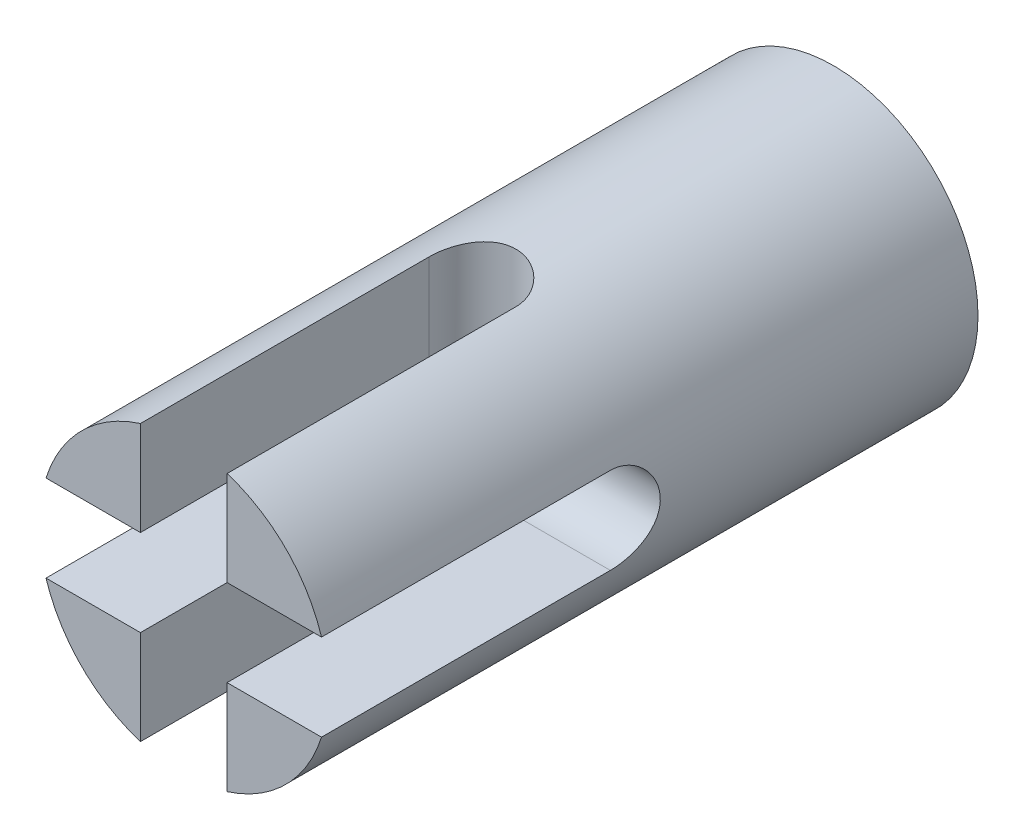
ISO-10303-21;
HEADER;
FILE_DESCRIPTION(('STEP AP214'),'2;1');
FILE_NAME('part.step','',(''),(''),'','','');
FILE_SCHEMA(('AUTOMOTIVE_DESIGN { 1 0 10303 214 1 1 1 1 }'));
ENDSEC;
DATA;
#1=APPLICATION_CONTEXT('core data for automotive mechanical design processes');
#2=APPLICATION_PROTOCOL_DEFINITION('international standard','automotive_design',2000,#1);
#3=PRODUCT_CONTEXT('',#1,'mechanical');
#4=PRODUCT('Part','Part','',(#3));
#5=PRODUCT_RELATED_PRODUCT_CATEGORY('part','',(#4));
#6=PRODUCT_DEFINITION_FORMATION('','',#4);
#7=PRODUCT_DEFINITION_CONTEXT('part definition',#1,'design');
#8=PRODUCT_DEFINITION('design','',#6,#7);
#9=PRODUCT_DEFINITION_SHAPE('','',#8);
#10=(LENGTH_UNIT() NAMED_UNIT(*) SI_UNIT(.MILLI.,.METRE.));
#11=(NAMED_UNIT(*) PLANE_ANGLE_UNIT() SI_UNIT($,.RADIAN.));
#12=(NAMED_UNIT(*) SI_UNIT($,.STERADIAN.) SOLID_ANGLE_UNIT());
#13=UNCERTAINTY_MEASURE_WITH_UNIT(LENGTH_MEASURE(1.E-05),#10,'distance_accuracy_value','');
#14=(GEOMETRIC_REPRESENTATION_CONTEXT(3) GLOBAL_UNCERTAINTY_ASSIGNED_CONTEXT((#13)) GLOBAL_UNIT_ASSIGNED_CONTEXT((#10,
#11,#12)) REPRESENTATION_CONTEXT('',''));
#15=CARTESIAN_POINT('',(0.,0.,0.));
#16=DIRECTION('',(0.,0.,1.));
#17=DIRECTION('',(1.,0.,0.));
#18=AXIS2_PLACEMENT_3D('',#15,#16,#17);
#19=CARTESIAN_POINT('',(0.,-22.5,25.));
#20=DIRECTION('',(0.,1.,0.));
#21=DIRECTION('',(0.,0.,1.));
#22=AXIS2_PLACEMENT_3D('',#19,#20,#21);
#23=CYLINDRICAL_SURFACE('',#22,3.);
#24=CARTESIAN_POINT('',(0.,0.,25.));
#25=DIRECTION('',(0.707106781186548,0.707106781186547,0.));
#26=DIRECTION('',(-0.707106781186548,0.707106781186547,0.));
#27=AXIS2_PLACEMENT_3D('',#24,#25,#26);
#28=ELLIPSE('',#27,4.24264068711929,3.);
#29=CARTESIAN_POINT('',(-3.,3.,25.));
#30=VERTEX_POINT('',#29);
#31=CARTESIAN_POINT('',(0.,0.,22.));
#32=VERTEX_POINT('',#31);
#33=EDGE_CURVE('E266',#30,#32,#28,.F.);
#34=ORIENTED_EDGE('',*,*,#33,.T.);
#35=CARTESIAN_POINT('',(0.,0.,25.));
#36=DIRECTION('',(-0.707106781186548,0.707106781186547,0.));
#37=DIRECTION('',(0.707106781186548,0.707106781186547,0.));
#38=AXIS2_PLACEMENT_3D('',#35,#36,#37);
#39=ELLIPSE('',#38,4.24264068711929,3.);
#40=CARTESIAN_POINT('',(3.,3.,25.));
#41=VERTEX_POINT('',#40);
#42=EDGE_CURVE('E162',#32,#41,#39,.F.);
#43=ORIENTED_EDGE('',*,*,#42,.T.);
#44=DIRECTION('',(0.,1.,0.));
#45=VECTOR('',#44,1.);
#46=CARTESIAN_POINT('',(3.,-22.5,25.));
#47=LINE('',#46,#45);
#48=CARTESIAN_POINT('',(3.,9.53939201416944,25.));
#49=VERTEX_POINT('',#48);
#50=EDGE_CURVE('E193',#41,#49,#47,.T.);
#51=ORIENTED_EDGE('',*,*,#50,.T.);
#52=CARTESIAN_POINT('',(-3.,9.53939201416946,25.));
#53=CARTESIAN_POINT('',(-3.00001027845727,9.53938054248207,24.9176644791773));
#54=CARTESIAN_POINT('',(-2.99661062684472,9.54045772064378,24.8353355449368));
#55=CARTESIAN_POINT('',(-2.98307142899347,9.54470412105986,24.6713060472345));
#56=CARTESIAN_POINT('',(-2.97293339805418,9.54787287296849,24.5896053466756));
#57=CARTESIAN_POINT('',(-2.94603140625045,9.55620668351003,24.4276150843268));
#58=CARTESIAN_POINT('',(-2.92928426957737,9.56136667250114,24.347322475957));
#59=CARTESIAN_POINT('',(-2.88932853030394,9.57351626651178,24.1885241558658));
#60=CARTESIAN_POINT('',(-2.8661197587264,9.58050591937828,24.1100184909326));
#61=CARTESIAN_POINT('',(-2.78708584446024,9.60391637654136,23.8780506120099));
#62=CARTESIAN_POINT('',(-2.72181852542972,9.62279007830391,23.727931561167));
#63=CARTESIAN_POINT('',(-2.56815043531276,9.66493213967819,23.440773956021));
#64=CARTESIAN_POINT('',(-2.4797388992416,9.68820254290641,23.3037415292378));
#65=CARTESIAN_POINT('',(-2.27929879634442,9.73733650515374,23.0422770120522));
#66=CARTESIAN_POINT('',(-2.16666914746584,9.76325505469874,22.9183151259391));
#67=CARTESIAN_POINT('',(-1.92227736150433,9.81429628475077,22.6907263851612));
#68=CARTESIAN_POINT('',(-1.79051199848164,9.8394188301941,22.587102966139));
#69=CARTESIAN_POINT('',(-1.50821997465697,9.88666477976534,22.4010731349054));
#70=CARTESIAN_POINT('',(-1.35736167401016,9.90871541546877,22.3191498202174));
#71=CARTESIAN_POINT('',(-1.04324233568303,9.94668940088144,22.1820229959971));
#72=CARTESIAN_POINT('',(-0.879984508687986,9.96261433032403,22.126812596632));
#73=CARTESIAN_POINT('',(-0.550649404820603,9.98615279768398,22.046240448209));
#74=CARTESIAN_POINT('',(-0.384786253016205,9.99399098526792,22.0200702964824));
#75=CARTESIAN_POINT('',(-0.0508471415689293,10.0012640407204,21.995765304854));
#76=CARTESIAN_POINT('',(0.117228393125338,10.0007004995012,21.9976251573218));
#77=CARTESIAN_POINT('',(0.445143199271824,9.99139205125586,22.0287858206914));
#78=CARTESIAN_POINT('',(0.605074290763028,9.98290831016512,22.0572106908081));
#79=CARTESIAN_POINT('',(0.917780104370315,9.95903027401822,22.1392632696255));
#80=CARTESIAN_POINT('',(1.07055445110879,9.94363561692558,22.1928922986827));
#81=CARTESIAN_POINT('',(1.36669563173912,9.90730429851782,22.3244244435247));
#82=CARTESIAN_POINT('',(1.50993201207613,9.88630511384915,22.4026032887761));
#83=CARTESIAN_POINT('',(1.78153105916101,9.84099249303646,22.5807971800344));
#84=CARTESIAN_POINT('',(1.90989038323251,9.81667831471806,22.6808171189407));
#85=CARTESIAN_POINT('',(2.15330901082206,9.7662334714278,22.9043839761846));
#86=CARTESIAN_POINT('',(2.26766702955976,9.74006890899097,23.0286877275262));
#87=CARTESIAN_POINT('',(2.47413538985067,9.68968430229327,23.2949948468511));
#88=CARTESIAN_POINT('',(2.56623924026181,9.66546482675134,23.4370033607298));
#89=CARTESIAN_POINT('',(2.72632814481702,9.62154457591303,23.7365618568999));
#90=CARTESIAN_POINT('',(2.79406012682263,9.60189192491895,23.8942543591871));
#91=CARTESIAN_POINT('',(2.90171772009405,9.56991327306402,24.2194490079631));
#92=CARTESIAN_POINT('',(2.94168586436073,9.55757606951749,24.3869357214287));
#93=CARTESIAN_POINT('',(2.97802407180159,9.54628064650012,24.6299897781404));
#94=CARTESIAN_POINT('',(2.98626405978018,9.54370312550533,24.7037814683592));
#95=CARTESIAN_POINT('',(2.99724711229709,9.54025857223564,24.851702958199));
#96=CARTESIAN_POINT('',(2.99999825936538,9.53938902493288,24.9258320993277));
#97=CARTESIAN_POINT('',(3.,9.53939201416945,25.));
#98=B_SPLINE_CURVE_WITH_KNOTS('',3,(#52,#53,#54,#55,#56,#57,#58,#59,#60,#61,#62,#63,#64,#65,#66,
#67,#68,#69,#70,#71,#72,#73,#74,#75,#76,#77,#78,#79,#80,#81,#82,#83,#84,#85,#86,#87,#88,#89,#90,
#91,#92,#93,#94,#95,#96,#97),.UNSPECIFIED.,.F.,.F.,(4,2,2,2,2,2,2,2,2,2,2,2,2,2,2,2,2,2,2,2,2,2,
4),(0.,0.246918142439467,0.493780777706087,0.740019009623012,0.986263681482023,1.47813347402025,
1.97023245590779,2.47635119822766,2.98255536239032,3.4992281062007,4.01576751791672,
4.51753600864763,5.019209488041,5.50490358251093,5.99062312360831,6.48200583350621,
6.9734987373917,7.48389234847122,7.99443465298715,8.51013494368214,9.02504345105574,
9.24774267716778,9.47011372732391),.UNSPECIFIED.);
#99=CARTESIAN_POINT('',(-3.,9.53939201416946,25.));
#100=VERTEX_POINT('',#99);
#101=EDGE_CURVE('E220',#100,#49,#98,.T.);
#102=ORIENTED_EDGE('',*,*,#101,.F.);
#103=DIRECTION('',(0.,1.,0.));
#104=VECTOR('',#103,1.);
#105=CARTESIAN_POINT('',(-3.,-22.5,25.));
#106=LINE('',#105,#104);
#107=EDGE_CURVE('E181',#30,#100,#106,.T.);
#108=ORIENTED_EDGE('',*,*,#107,.F.);
#109=EDGE_LOOP('',(#34,#43,#51,#102,#108));
#110=FACE_BOUND('',#109,.T.);
#111=ADVANCED_FACE('F41',(#110),#23,.F.);
#112=CARTESIAN_POINT('',(0.,0.,45.));
#113=DIRECTION('',(0.,0.,1.));
#114=DIRECTION('',(1.,0.,0.));
#115=AXIS2_PLACEMENT_3D('',#112,#113,#114);
#116=PLANE('',#115);
#117=DIRECTION('',(-1.,0.,0.));
#118=VECTOR('',#117,1.);
#119=CARTESIAN_POINT('',(14.5317517371379,3.,45.));
#120=LINE('',#119,#118);
#121=CARTESIAN_POINT('',(-2.99999999999999,3.,45.));
#122=VERTEX_POINT('',#121);
#123=CARTESIAN_POINT('',(-9.53939201416946,3.,45.));
#124=VERTEX_POINT('',#123);
#125=EDGE_CURVE('E297',#122,#124,#120,.T.);
#126=ORIENTED_EDGE('',*,*,#125,.F.);
#127=DIRECTION('',(0.,-1.,0.));
#128=VECTOR('',#127,1.);
#129=CARTESIAN_POINT('',(-2.99999999999999,0.,45.));
#130=LINE('',#129,#128);
#131=CARTESIAN_POINT('',(-2.99999999999999,9.53939201416944,45.));
#132=VERTEX_POINT('',#131);
#133=EDGE_CURVE('E217',#132,#122,#130,.T.);
#134=ORIENTED_EDGE('',*,*,#133,.F.);
#135=CARTESIAN_POINT('',(0.,0.,45.));
#136=DIRECTION('',(0.,0.,1.));
#137=DIRECTION('',(1.,0.,0.));
#138=AXIS2_PLACEMENT_3D('',#135,#136,#137);
#139=CIRCLE('',#138,10.);
#140=EDGE_CURVE('E208',#132,#124,#139,.T.);
#141=ORIENTED_EDGE('',*,*,#140,.T.);
#142=EDGE_LOOP('',(#126,#134,#141));
#143=FACE_BOUND('',#142,.T.);
#144=ADVANCED_FACE('F249',(#143),#116,.T.);
#145=CARTESIAN_POINT('',(9.53939201416946,3.,45.));
#146=VERTEX_POINT('',#145);
#147=CARTESIAN_POINT('',(3.00000000000001,3.,45.));
#148=VERTEX_POINT('',#147);
#149=EDGE_CURVE('E292',#146,#148,#120,.T.);
#150=ORIENTED_EDGE('',*,*,#149,.F.);
#151=CARTESIAN_POINT('',(3.00000000000001,9.53939201416944,45.));
#152=VERTEX_POINT('',#151);
#153=EDGE_CURVE('E207',#146,#152,#139,.T.);
#154=ORIENTED_EDGE('',*,*,#153,.T.);
#155=DIRECTION('',(0.,1.,0.));
#156=VECTOR('',#155,1.);
#157=CARTESIAN_POINT('',(3.00000000000001,0.,45.));
#158=LINE('',#157,#156);
#159=EDGE_CURVE('E216',#148,#152,#158,.T.);
#160=ORIENTED_EDGE('',*,*,#159,.F.);
#161=EDGE_LOOP('',(#150,#154,#160));
#162=FACE_BOUND('',#161,.T.);
#163=ADVANCED_FACE('F262',(#162),#116,.T.);
#164=CARTESIAN_POINT('',(-2.99999999999999,-22.5,45.));
#165=DIRECTION('',(-1.,0.,0.));
#166=DIRECTION('',(0.,0.,1.));
#167=AXIS2_PLACEMENT_3D('',#164,#165,#166);
#168=PLANE('',#167);
#169=ORIENTED_EDGE('',*,*,#133,.T.);
#170=DIRECTION('',(0.,0.,-1.));
#171=VECTOR('',#170,1.);
#172=CARTESIAN_POINT('',(-2.99999999999999,3.,45.));
#173=LINE('',#172,#171);
#174=EDGE_CURVE('E306',#122,#30,#173,.T.);
#175=ORIENTED_EDGE('',*,*,#174,.T.);
#176=ORIENTED_EDGE('',*,*,#107,.T.);
#177=DIRECTION('',(0.,0.,-1.));
#178=VECTOR('',#177,1.);
#179=CARTESIAN_POINT('',(-2.99999999999999,9.53939201416946,45.));
#180=LINE('',#179,#178);
#181=EDGE_CURVE('E66',#132,#100,#180,.T.);
#182=ORIENTED_EDGE('',*,*,#181,.F.);
#183=EDGE_LOOP('',(#169,#175,#176,#182));
#184=FACE_BOUND('',#183,.T.);
#185=ADVANCED_FACE('F379',(#184),#168,.F.);
#186=CARTESIAN_POINT('',(3.00000000000001,-22.5,45.));
#187=DIRECTION('',(1.,0.,0.));
#188=DIRECTION('',(0.,0.,-1.));
#189=AXIS2_PLACEMENT_3D('',#186,#187,#188);
#190=PLANE('',#189);
#191=ORIENTED_EDGE('',*,*,#50,.F.);
#192=DIRECTION('',(0.,0.,1.));
#193=VECTOR('',#192,1.);
#194=CARTESIAN_POINT('',(3.00000000000001,3.,45.));
#195=LINE('',#194,#193);
#196=EDGE_CURVE('E11',#41,#148,#195,.T.);
#197=ORIENTED_EDGE('',*,*,#196,.T.);
#198=ORIENTED_EDGE('',*,*,#159,.T.);
#199=DIRECTION('',(0.,0.,-1.));
#200=VECTOR('',#199,1.);
#201=CARTESIAN_POINT('',(3.,9.53939201416945,45.));
#202=LINE('',#201,#200);
#203=EDGE_CURVE('E180',#49,#152,#202,.F.);
#204=ORIENTED_EDGE('',*,*,#203,.F.);
#205=EDGE_LOOP('',(#191,#197,#198,#204));
#206=FACE_BOUND('',#205,.T.);
#207=ADVANCED_FACE('F245',(#206),#190,.F.);
#208=DIRECTION('',(1.,0.,0.));
#209=VECTOR('',#208,1.);
#210=CARTESIAN_POINT('',(14.5317517371379,-3.,45.));
#211=LINE('',#210,#209);
#212=CARTESIAN_POINT('',(-9.53939201416946,-3.,45.));
#213=VERTEX_POINT('',#212);
#214=CARTESIAN_POINT('',(-2.99999999999999,-3.,45.));
#215=VERTEX_POINT('',#214);
#216=EDGE_CURVE('E168',#213,#215,#211,.T.);
#217=ORIENTED_EDGE('',*,*,#216,.F.);
#218=CARTESIAN_POINT('',(-2.99999999999999,-9.53939201416946,45.));
#219=VERTEX_POINT('',#218);
#220=EDGE_CURVE('E206',#213,#219,#139,.T.);
#221=ORIENTED_EDGE('',*,*,#220,.T.);
#222=EDGE_CURVE('E215',#215,#219,#130,.T.);
#223=ORIENTED_EDGE('',*,*,#222,.F.);
#224=EDGE_LOOP('',(#217,#221,#223));
#225=FACE_BOUND('',#224,.T.);
#226=ADVANCED_FACE('F250',(#225),#116,.T.);
#227=CARTESIAN_POINT('',(0.,0.,45.));
#228=DIRECTION('',(0.,0.,-1.));
#229=DIRECTION('',(-1.,0.,0.));
#230=AXIS2_PLACEMENT_3D('',#227,#228,#229);
#231=CYLINDRICAL_SURFACE('',#230,10.);
#232=DIRECTION('',(0.,0.,-1.));
#233=VECTOR('',#232,1.);
#234=CARTESIAN_POINT('',(-9.53939201416945,-3.,45.));
#235=LINE('',#234,#233);
#236=CARTESIAN_POINT('',(-9.53939201416946,-3.,25.));
#237=VERTEX_POINT('',#236);
#238=EDGE_CURVE('E303',#213,#237,#235,.T.);
#239=ORIENTED_EDGE('',*,*,#238,.T.);
#240=CARTESIAN_POINT('',(-10.,0.,28.));
#241=CARTESIAN_POINT('',(-9.99999858501101,-0.1645772255066,27.9999980050302));
#242=CARTESIAN_POINT('',(-9.99589831387907,-0.329174636703059,27.9864122727521));
#243=CARTESIAN_POINT('',(-9.97994211187382,-0.653576250609761,27.9325572915558));
#244=CARTESIAN_POINT('',(-9.96808386779384,-0.81337900882284,27.8922800839533));
#245=CARTESIAN_POINT('',(-9.93791105003673,-1.12346541550905,27.7865079661795));
#246=CARTESIAN_POINT('',(-9.91960600500851,-1.27376272879075,27.7210502607621));
#247=CARTESIAN_POINT('',(-9.87844218475291,-1.56124836210626,27.5669278138883));
#248=CARTESIAN_POINT('',(-9.85558280384133,-1.69843493493934,27.4782599852092));
#249=CARTESIAN_POINT('',(-9.80701474385548,-1.95974359436749,27.2775519850547));
#250=CARTESIAN_POINT('',(-9.78124767314073,-2.08343614248868,27.1649667482282));
#251=CARTESIAN_POINT('',(-9.73011668420884,-2.31049841846648,26.9207815401796));
#252=CARTESIAN_POINT('',(-9.70475283449003,-2.41386472654882,26.7891783757501));
#253=CARTESIAN_POINT('',(-9.65668227987544,-2.59960075447415,26.5070584939248));
#254=CARTESIAN_POINT('',(-9.63404813327749,-2.68144618044427,26.3561830780185));
#255=CARTESIAN_POINT('',(-9.59487240788062,-2.81842789549521,26.0420214915394));
#256=CARTESIAN_POINT('',(-9.57832936626621,-2.87357059839947,25.8787383121441));
#257=CARTESIAN_POINT('',(-9.55381741676868,-2.95403267365303,25.5492194677391));
#258=CARTESIAN_POINT('',(-9.54562138649067,-2.98014392469355,25.3831945122721));
#259=CARTESIAN_POINT('',(-9.53805579499534,-3.00427461229344,25.0489336875665));
#260=CARTESIAN_POINT('',(-9.53868409521142,-3.00230085522157,24.8806983638818));
#261=CARTESIAN_POINT('',(-9.54849488135555,-2.97093954399624,24.553232182783));
#262=CARTESIAN_POINT('',(-9.55736777198281,-2.94254410525371,24.3938954992755));
#263=CARTESIAN_POINT('',(-9.58216712457248,-2.86074840854112,24.0823604274531));
#264=CARTESIAN_POINT('',(-9.59809428264701,-2.80734568283282,23.9301627452513));
#265=CARTESIAN_POINT('',(-9.63545466149946,-2.67632053307364,23.6347993006785));
#266=CARTESIAN_POINT('',(-9.65696032231904,-2.59837633869285,23.4917858320895));
#267=CARTESIAN_POINT('',(-9.70301974000129,-2.42070445177367,23.2205359559796));
#268=CARTESIAN_POINT('',(-9.72757423493982,-2.32097148005177,23.0923031411724));
#269=CARTESIAN_POINT('',(-9.77822022595875,-2.09762581531093,22.848627618476));
#270=CARTESIAN_POINT('',(-9.80433308620996,-1.97318981493395,22.7339426719407));
#271=CARTESIAN_POINT('',(-9.85424488126517,-1.70652651862794,22.5268920318715));
#272=CARTESIAN_POINT('',(-9.8780436703682,-1.56429810372178,22.4345277431711));
#273=CARTESIAN_POINT('',(-9.92086320138941,-1.26471007668561,22.2742801550705));
#274=CARTESIAN_POINT('',(-9.93985087336628,-1.1072554994959,22.2065649675003));
#275=CARTESIAN_POINT('',(-9.97067043664444,-0.782490831207043,22.0988008198007));
#276=CARTESIAN_POINT('',(-9.98250432373999,-0.615183503179168,22.058744142935));
#277=CARTESIAN_POINT('',(-9.99736729287077,-0.281904485336667,22.0086956442012));
#278=CARTESIAN_POINT('',(-10.0006970083558,-0.116100195202377,21.9976768283968));
#279=CARTESIAN_POINT('',(-9.99905846483519,0.214999211646763,22.0031383114242));
#280=CARTESIAN_POINT('',(-9.99409131355514,0.380294393381558,22.0196149393029));
#281=CARTESIAN_POINT('',(-9.97661393974325,0.701807210619391,22.078769222223));
#282=CARTESIAN_POINT('',(-9.96427659598829,0.858145545228336,22.1208467751617));
#283=CARTESIAN_POINT('',(-9.9334869568307,1.16150927790904,22.2292864655564));
#284=CARTESIAN_POINT('',(-9.91503392642188,1.30853355405117,22.2956515220757));
#285=CARTESIAN_POINT('',(-9.87339308702631,1.5928743789221,22.4525063309623));
#286=CARTESIAN_POINT('',(-9.8501056165928,1.72988765239933,22.543518681896));
#287=CARTESIAN_POINT('',(-9.80146937528705,1.9870466159603,22.7464495081056));
#288=CARTESIAN_POINT('',(-9.7761200886242,2.10718806471188,22.8583732237753));
#289=CARTESIAN_POINT('',(-9.72506343738007,2.33171489102052,23.1047746167387));
#290=CARTESIAN_POINT('',(-9.69937650065513,2.43536962463001,23.2399237515436));
#291=CARTESIAN_POINT('',(-9.65153030477949,2.61857990144313,23.5262558780269));
#292=CARTESIAN_POINT('',(-9.62937095313121,2.69813607658965,23.6774384491158));
#293=CARTESIAN_POINT('',(-9.5913437922631,2.83034694254316,23.99106498251));
#294=CARTESIAN_POINT('',(-9.57544675673501,2.88312693874021,24.1534523730757));
#295=CARTESIAN_POINT('',(-9.55183188739737,2.96043461630306,24.4853759378605));
#296=CARTESIAN_POINT('',(-9.54411125069387,2.98497197957849,24.6549096415661));
#297=CARTESIAN_POINT('',(-9.53799944941558,3.0044396896993,24.9887230367768));
#298=CARTESIAN_POINT('',(-9.53923294700394,3.00056110615887,25.1529273020988));
#299=CARTESIAN_POINT('',(-9.54998802392188,2.9661501088861,25.4782282068012));
#300=CARTESIAN_POINT('',(-9.55950927135902,2.93561876249408,25.639324970361));
#301=CARTESIAN_POINT('',(-9.58551527389243,2.84953777608686,25.9518907982633));
#302=CARTESIAN_POINT('',(-9.60191209104934,2.79430351014248,26.1034545747174));
#303=CARTESIAN_POINT('',(-9.63980557805265,2.66063014242147,26.3952848776414));
#304=CARTESIAN_POINT('',(-9.6613032238508,2.58218659925722,26.5355492352831));
#305=CARTESIAN_POINT('',(-9.70795352855338,2.40097527610176,26.8063262330525));
#306=CARTESIAN_POINT('',(-9.7332108032858,2.29742552185996,26.9362975225204));
#307=CARTESIAN_POINT('',(-9.78402640899066,2.07034869259555,27.1774049966162));
#308=CARTESIAN_POINT('',(-9.80958481647543,1.94681643426898,27.2885362789356));
#309=CARTESIAN_POINT('',(-9.85901873141573,1.67893152436652,27.4920468245899));
#310=CARTESIAN_POINT('',(-9.88282319531421,1.53407577158122,27.5837828937109));
#311=CARTESIAN_POINT('',(-9.92521360911553,1.23028274796705,27.7414703398081));
#312=CARTESIAN_POINT('',(-9.94380199862114,1.07135210599791,27.807433776549));
#313=CARTESIAN_POINT('',(-9.97204349938619,0.761515425310564,27.9057905513055));
#314=CARTESIAN_POINT('',(-9.9824405476214,0.611573923908468,27.9410233457665));
#315=CARTESIAN_POINT('',(-9.9964188898898,0.307760390461558,27.9881270504832));
#316=CARTESIAN_POINT('',(-10.0000013230948,0.153889019716279,28.0000018654096));
#317=CARTESIAN_POINT('',(-10.,0.,28.));
#318=B_SPLINE_CURVE_WITH_KNOTS('',3,(#240,#241,#242,#243,#244,#245,#246,#247,#248,#249,#250,
#251,#252,#253,#254,#255,#256,#257,#258,#259,#260,#261,#262,#263,#264,#265,#266,#267,#268,#269,
#270,#271,#272,#273,#274,#275,#276,#277,#278,#279,#280,#281,#282,#283,#284,#285,#286,#287,#288,
#289,#290,#291,#292,#293,#294,#295,#296,#297,#298,#299,#300,#301,#302,#303,#304,#305,#306,#307,
#308,#309,#310,#311,#312,#313,#314,#315,#316,#317),.UNSPECIFIED.,.T.,.F.,(4,2,2,2,2,2,2,2,2,2,2,
2,2,2,2,2,2,2,2,2,2,2,2,2,2,2,2,2,2,2,2,2,2,2,2,2,2,2,4),(0.,0.493166407225221,0.986479929692,
1.47906735260175,1.97172032882541,2.47711205896383,2.98258874577266,3.49942962008218,
4.01614629086447,4.51839378713198,5.02051956638179,5.50452033395352,5.98856887316002,
6.47924852894239,6.97004720317111,7.48134208096333,7.99266913062143,8.50742093763377,
9.02202907057615,9.5181761887709,10.0142570710065,10.4991349336465,10.9840710918746,
11.4802261140582,11.9765056400038,12.4908080064564,13.0050968850536,13.516956299025,
14.0286401892057,14.5190031093854,15.0093463933232,15.4936008081456,15.9779479511534,
16.4799385136898,16.9820594980413,17.4988599232246,18.0154182319959,18.4766338387004,
18.9377723390687),.UNSPECIFIED.);
#319=CARTESIAN_POINT('',(-9.53939201416944,3.00000000000007,25.0000000000001));
#320=VERTEX_POINT('',#319);
#321=EDGE_CURVE('E144',#237,#320,#318,.T.);
#322=ORIENTED_EDGE('',*,*,#321,.T.);
#323=DIRECTION('',(0.,0.,-1.));
#324=VECTOR('',#323,1.);
#325=CARTESIAN_POINT('',(-9.53939201416945,3.,45.));
#326=LINE('',#325,#324);
#327=EDGE_CURVE('E309',#320,#124,#326,.F.);
#328=ORIENTED_EDGE('',*,*,#327,.T.);
#329=ORIENTED_EDGE('',*,*,#140,.F.);
#330=ORIENTED_EDGE('',*,*,#181,.T.);
#331=ORIENTED_EDGE('',*,*,#101,.T.);
#332=ORIENTED_EDGE('',*,*,#203,.T.);
#333=ORIENTED_EDGE('',*,*,#153,.F.);
#334=DIRECTION('',(0.,0.,-1.));
#335=VECTOR('',#334,1.);
#336=CARTESIAN_POINT('',(9.53939201416945,3.,45.));
#337=LINE('',#336,#335);
#338=CARTESIAN_POINT('',(9.53939201416946,3.,25.));
#339=VERTEX_POINT('',#338);
#340=EDGE_CURVE('E190',#146,#339,#337,.T.);
#341=ORIENTED_EDGE('',*,*,#340,.T.);
#342=CARTESIAN_POINT('',(10.,0.,28.));
#343=CARTESIAN_POINT('',(9.999998585011,0.164577225506598,27.9999980050302));
#344=CARTESIAN_POINT('',(9.99589831387907,0.329174636703057,27.9864122727521));
#345=CARTESIAN_POINT('',(9.97994211187382,0.65357625060976,27.9325572915558));
#346=CARTESIAN_POINT('',(9.96808386779384,0.813379008822838,27.8922800839533));
#347=CARTESIAN_POINT('',(9.93791105003673,1.12346541550905,27.7865079661795));
#348=CARTESIAN_POINT('',(9.91960600500851,1.27376272879075,27.7210502607621));
#349=CARTESIAN_POINT('',(9.87844218475291,1.56124836210626,27.5669278138883));
#350=CARTESIAN_POINT('',(9.85558280384133,1.69843493493934,27.4782599852092));
#351=CARTESIAN_POINT('',(9.80701474385548,1.95974359436749,27.2775519850547));
#352=CARTESIAN_POINT('',(9.78124767314073,2.08343614248868,27.1649667482282));
#353=CARTESIAN_POINT('',(9.73011668420884,2.31049841846647,26.9207815401796));
#354=CARTESIAN_POINT('',(9.70475283449003,2.41386472654882,26.7891783757501));
#355=CARTESIAN_POINT('',(9.65668227987544,2.59960075447415,26.5070584939248));
#356=CARTESIAN_POINT('',(9.63404813327749,2.68144618044427,26.3561830780185));
#357=CARTESIAN_POINT('',(9.59487240788062,2.81842789549521,26.0420214915394));
#358=CARTESIAN_POINT('',(9.57832936626621,2.87357059839947,25.878738312144));
#359=CARTESIAN_POINT('',(9.55381741676868,2.95403267365303,25.5492194677391));
#360=CARTESIAN_POINT('',(9.54562138649067,2.98014392469355,25.3831945122721));
#361=CARTESIAN_POINT('',(9.53805579499534,3.00427461229344,25.0489336875665));
#362=CARTESIAN_POINT('',(9.53868409521142,3.00230085522157,24.8806983638818));
#363=CARTESIAN_POINT('',(9.54849488135555,2.97093954399623,24.553232182783));
#364=CARTESIAN_POINT('',(9.55736777198281,2.9425441052537,24.3938954992755));
#365=CARTESIAN_POINT('',(9.58216712457249,2.86074840854112,24.0823604274531));
#366=CARTESIAN_POINT('',(9.59809428264701,2.80734568283282,23.9301627452513));
#367=CARTESIAN_POINT('',(9.63545466149946,2.67632053307363,23.6347993006785));
#368=CARTESIAN_POINT('',(9.65696032231904,2.59837633869285,23.4917858320895));
#369=CARTESIAN_POINT('',(9.70301974000129,2.42070445177367,23.2205359559796));
#370=CARTESIAN_POINT('',(9.72757423493982,2.32097148005177,23.0923031411724));
#371=CARTESIAN_POINT('',(9.77822022595875,2.09762581531093,22.848627618476));
#372=CARTESIAN_POINT('',(9.80433308620996,1.97318981493394,22.7339426719407));
#373=CARTESIAN_POINT('',(9.85424488126517,1.70652651862793,22.5268920318715));
#374=CARTESIAN_POINT('',(9.8780436703682,1.56429810372177,22.4345277431711));
#375=CARTESIAN_POINT('',(9.92086320138941,1.2647100766856,22.2742801550705));
#376=CARTESIAN_POINT('',(9.93985087336628,1.1072554994959,22.2065649675003));
#377=CARTESIAN_POINT('',(9.97067043664444,0.782490831207037,22.0988008198007));
#378=CARTESIAN_POINT('',(9.98250432373999,0.615183503179161,22.058744142935));
#379=CARTESIAN_POINT('',(9.99736729287077,0.281904485336662,22.0086956442012));
#380=CARTESIAN_POINT('',(10.0006970083558,0.116100195202372,21.9976768283968));
#381=CARTESIAN_POINT('',(9.99905846483519,-0.214999211646768,22.0031383114242));
#382=CARTESIAN_POINT('',(9.99409131355514,-0.380294393381564,22.0196149393029));
#383=CARTESIAN_POINT('',(9.97661393974325,-0.701807210619397,22.078769222223));
#384=CARTESIAN_POINT('',(9.96427659598829,-0.858145545228341,22.1208467751617));
#385=CARTESIAN_POINT('',(9.9334869568307,-1.16150927790905,22.2292864655564));
#386=CARTESIAN_POINT('',(9.91503392642188,-1.30853355405117,22.2956515220757));
#387=CARTESIAN_POINT('',(9.87339308702631,-1.59287437892211,22.4525063309623));
#388=CARTESIAN_POINT('',(9.8501056165928,-1.72988765239934,22.543518681896));
#389=CARTESIAN_POINT('',(9.80146937528704,-1.9870466159603,22.7464495081056));
#390=CARTESIAN_POINT('',(9.7761200886242,-2.10718806471189,22.8583732237753));
#391=CARTESIAN_POINT('',(9.72506343738007,-2.33171489102053,23.1047746167387));
#392=CARTESIAN_POINT('',(9.69937650065513,-2.43536962463002,23.2399237515436));
#393=CARTESIAN_POINT('',(9.65153030477949,-2.61857990144313,23.5262558780269));
#394=CARTESIAN_POINT('',(9.62937095313121,-2.69813607658965,23.6774384491158));
#395=CARTESIAN_POINT('',(9.59134379226309,-2.83034694254316,23.99106498251));
#396=CARTESIAN_POINT('',(9.575446756735,-2.88312693874022,24.1534523730757));
#397=CARTESIAN_POINT('',(9.55183188739737,-2.96043461630306,24.4853759378605));
#398=CARTESIAN_POINT('',(9.54411125069387,-2.98497197957849,24.6549096415661));
#399=CARTESIAN_POINT('',(9.53799944941558,-3.0044396896993,24.9887230367768));
#400=CARTESIAN_POINT('',(9.53923294700394,-3.00056110615887,25.1529273020988));
#401=CARTESIAN_POINT('',(9.54998802392188,-2.96615010888611,25.4782282068012));
#402=CARTESIAN_POINT('',(9.55950927135902,-2.93561876249408,25.639324970361));
#403=CARTESIAN_POINT('',(9.58551527389243,-2.84953777608686,25.9518907982633));
#404=CARTESIAN_POINT('',(9.60191209104934,-2.79430351014248,26.1034545747174));
#405=CARTESIAN_POINT('',(9.63980557805265,-2.66063014242148,26.3952848776414));
#406=CARTESIAN_POINT('',(9.6613032238508,-2.58218659925723,26.5355492352831));
#407=CARTESIAN_POINT('',(9.70795352855338,-2.40097527610176,26.8063262330525));
#408=CARTESIAN_POINT('',(9.7332108032858,-2.29742552185996,26.9362975225204));
#409=CARTESIAN_POINT('',(9.78402640899066,-2.07034869259556,27.1774049966162));
#410=CARTESIAN_POINT('',(9.80958481647543,-1.94681643426898,27.2885362789356));
#411=CARTESIAN_POINT('',(9.85901873141573,-1.67893152436652,27.4920468245899));
#412=CARTESIAN_POINT('',(9.88282319531422,-1.53407577158122,27.5837828937109));
#413=CARTESIAN_POINT('',(9.92521360911553,-1.23028274796705,27.7414703398081));
#414=CARTESIAN_POINT('',(9.94380199862114,-1.07135210599791,27.807433776549));
#415=CARTESIAN_POINT('',(9.97204349938619,-0.761515425310564,27.9057905513055));
#416=CARTESIAN_POINT('',(9.9824405476214,-0.611573923908469,27.9410233457665));
#417=CARTESIAN_POINT('',(9.9964188898898,-0.307760390461559,27.9881270504832));
#418=CARTESIAN_POINT('',(10.0000013230948,-0.15388901971628,28.0000018654096));
#419=CARTESIAN_POINT('',(10.,0.,28.));
#420=B_SPLINE_CURVE_WITH_KNOTS('',3,(#342,#343,#344,#345,#346,#347,#348,#349,#350,#351,#352,
#353,#354,#355,#356,#357,#358,#359,#360,#361,#362,#363,#364,#365,#366,#367,#368,#369,#370,#371,
#372,#373,#374,#375,#376,#377,#378,#379,#380,#381,#382,#383,#384,#385,#386,#387,#388,#389,#390,
#391,#392,#393,#394,#395,#396,#397,#398,#399,#400,#401,#402,#403,#404,#405,#406,#407,#408,#409,
#410,#411,#412,#413,#414,#415,#416,#417,#418,#419),.UNSPECIFIED.,.T.,.F.,(4,2,2,2,2,2,2,2,2,2,2,
2,2,2,2,2,2,2,2,2,2,2,2,2,2,2,2,2,2,2,2,2,2,2,2,2,2,2,4),(0.,0.493166407225221,0.986479929692,
1.47906735260175,1.97172032882541,2.47711205896383,2.98258874577266,3.49942962008218,
4.01614629086448,4.51839378713198,5.02051956638179,5.50452033395352,5.98856887316003,
6.47924852894239,6.97004720317111,7.48134208096334,7.99266913062143,8.50742093763377,
9.02202907057616,9.5181761887709,10.0142570710065,10.4991349336465,10.9840710918746,
11.4802261140582,11.9765056400038,12.4908080064564,13.0050968850536,13.516956299025,
14.0286401892057,14.5190031093854,15.0093463933232,15.4936008081456,15.9779479511534,
16.4799385136898,16.9820594980413,17.4988599232246,18.0154182319959,18.4766338387004,
18.9377723390687),.UNSPECIFIED.);
#421=CARTESIAN_POINT('',(9.53939201416946,-3.,25.));
#422=VERTEX_POINT('',#421);
#423=EDGE_CURVE('E272',#339,#422,#420,.T.);
#424=ORIENTED_EDGE('',*,*,#423,.T.);
#425=DIRECTION('',(0.,0.,-1.));
#426=VECTOR('',#425,1.);
#427=CARTESIAN_POINT('',(9.53939201416945,-3.,45.));
#428=LINE('',#427,#426);
#429=CARTESIAN_POINT('',(9.53939201416946,-3.,45.));
#430=VERTEX_POINT('',#429);
#431=EDGE_CURVE('E173',#422,#430,#428,.F.);
#432=ORIENTED_EDGE('',*,*,#431,.T.);
#433=CARTESIAN_POINT('',(3.00000000000001,-9.53939201416945,45.));
#434=VERTEX_POINT('',#433);
#435=EDGE_CURVE('E202',#434,#430,#139,.T.);
#436=ORIENTED_EDGE('',*,*,#435,.F.);
#437=DIRECTION('',(0.,0.,-1.));
#438=VECTOR('',#437,1.);
#439=CARTESIAN_POINT('',(3.,-9.53939201416945,45.));
#440=LINE('',#439,#438);
#441=CARTESIAN_POINT('',(3.,-9.53939201416946,25.));
#442=VERTEX_POINT('',#441);
#443=EDGE_CURVE('E58',#434,#442,#440,.T.);
#444=ORIENTED_EDGE('',*,*,#443,.T.);
#445=CARTESIAN_POINT('',(3.,-9.53939201416945,25.));
#446=CARTESIAN_POINT('',(3.00001027845728,-9.53938054248206,24.9176644791773));
#447=CARTESIAN_POINT('',(2.99661062684473,-9.54045772064378,24.8353355449368));
#448=CARTESIAN_POINT('',(2.98307142899347,-9.54470412105986,24.6713060472345));
#449=CARTESIAN_POINT('',(2.97293339805419,-9.54787287296848,24.5896053466756));
#450=CARTESIAN_POINT('',(2.94603140625045,-9.55620668351003,24.4276150843268));
#451=CARTESIAN_POINT('',(2.92928426957737,-9.56136667250114,24.347322475957));
#452=CARTESIAN_POINT('',(2.88932853030395,-9.57351626651178,24.1885241558658));
#453=CARTESIAN_POINT('',(2.86611975872641,-9.58050591937828,24.1100184909326));
#454=CARTESIAN_POINT('',(2.78708584446025,-9.60391637654137,23.8780506120099));
#455=CARTESIAN_POINT('',(2.72181852542973,-9.62279007830391,23.727931561167));
#456=CARTESIAN_POINT('',(2.56815043531276,-9.66493213967819,23.440773956021));
#457=CARTESIAN_POINT('',(2.4797388992416,-9.68820254290641,23.3037415292378));
#458=CARTESIAN_POINT('',(2.27929879634443,-9.73733650515374,23.0422770120522));
#459=CARTESIAN_POINT('',(2.16666914746584,-9.76325505469874,22.9183151259391));
#460=CARTESIAN_POINT('',(1.92227736150433,-9.81429628475077,22.6907263851612));
#461=CARTESIAN_POINT('',(1.79051199848164,-9.8394188301941,22.587102966139));
#462=CARTESIAN_POINT('',(1.50821997465697,-9.88666477976534,22.4010731349054));
#463=CARTESIAN_POINT('',(1.35736167401016,-9.90871541546877,22.3191498202174));
#464=CARTESIAN_POINT('',(1.04324233568303,-9.94668940088144,22.1820229959971));
#465=CARTESIAN_POINT('',(0.879984508687987,-9.96261433032403,22.126812596632));
#466=CARTESIAN_POINT('',(0.550649404820604,-9.98615279768398,22.046240448209));
#467=CARTESIAN_POINT('',(0.384786253016205,-9.99399098526792,22.0200702964824));
#468=CARTESIAN_POINT('',(0.0508471415689298,-10.0012640407204,21.995765304854));
#469=CARTESIAN_POINT('',(-0.117228393125337,-10.0007004995012,21.9976251573218));
#470=CARTESIAN_POINT('',(-0.445143199271822,-9.99139205125586,22.0287858206914));
#471=CARTESIAN_POINT('',(-0.605074290763025,-9.98290831016512,22.0572106908081));
#472=CARTESIAN_POINT('',(-0.917780104370311,-9.95903027401822,22.1392632696255));
#473=CARTESIAN_POINT('',(-1.07055445110879,-9.94363561692558,22.1928922986827));
#474=CARTESIAN_POINT('',(-1.36669563173911,-9.90730429851782,22.3244244435247));
#475=CARTESIAN_POINT('',(-1.50993201207612,-9.88630511384915,22.4026032887761));
#476=CARTESIAN_POINT('',(-1.781531059161,-9.84099249303647,22.5807971800344));
#477=CARTESIAN_POINT('',(-1.9098903832325,-9.81667831471806,22.6808171189407));
#478=CARTESIAN_POINT('',(-2.15330901082205,-9.7662334714278,22.9043839761846));
#479=CARTESIAN_POINT('',(-2.26766702955975,-9.74006890899097,23.0286877275262));
#480=CARTESIAN_POINT('',(-2.47413538985067,-9.68968430229327,23.2949948468511));
#481=CARTESIAN_POINT('',(-2.5662392402618,-9.66546482675134,23.4370033607298));
#482=CARTESIAN_POINT('',(-2.72632814481701,-9.62154457591303,23.7365618568999));
#483=CARTESIAN_POINT('',(-2.79406012682262,-9.60189192491895,23.8942543591871));
#484=CARTESIAN_POINT('',(-2.90171772009404,-9.56991327306402,24.2194490079631));
#485=CARTESIAN_POINT('',(-2.94168586436072,-9.55757606951749,24.3869357214287));
#486=CARTESIAN_POINT('',(-2.97802407180158,-9.54628064650012,24.6299897781404));
#487=CARTESIAN_POINT('',(-2.98626405978017,-9.54370312550533,24.7037814683592));
#488=CARTESIAN_POINT('',(-2.99724711229708,-9.54025857223564,24.851702958199));
#489=CARTESIAN_POINT('',(-2.99999825936538,-9.53938902493288,24.9258320993277));
#490=CARTESIAN_POINT('',(-3.,-9.53939201416946,25.));
#491=B_SPLINE_CURVE_WITH_KNOTS('',3,(#445,#446,#447,#448,#449,#450,#451,#452,#453,#454,#455,
#456,#457,#458,#459,#460,#461,#462,#463,#464,#465,#466,#467,#468,#469,#470,#471,#472,#473,#474,
#475,#476,#477,#478,#479,#480,#481,#482,#483,#484,#485,#486,#487,#488,#489,#490),.UNSPECIFIED.,
.F.,.F.,(4,2,2,2,2,2,2,2,2,2,2,2,2,2,2,2,2,2,2,2,2,2,4),(0.,0.246918142439467,0.493780777706087,
0.740019009623016,0.986263681482027,1.47813347402026,1.97023245590779,2.47635119822767,
2.98255536239033,3.49922810620071,4.01576751791672,4.51753600864764,5.01920948804101,
5.50490358251093,5.99062312360832,6.48200583350621,6.9734987373917,7.48389234847123,
7.99443465298716,8.51013494368214,9.02504345105574,9.24774267716778,9.47011372732391),.UNSPECIFIED.);
#492=CARTESIAN_POINT('',(-3.,-9.53939201416945,25.));
#493=VERTEX_POINT('',#492);
#494=EDGE_CURVE('E229',#442,#493,#491,.T.);
#495=ORIENTED_EDGE('',*,*,#494,.T.);
#496=DIRECTION('',(0.,0.,-1.));
#497=VECTOR('',#496,1.);
#498=CARTESIAN_POINT('',(-2.99999999999999,-9.53939201416946,45.));
#499=LINE('',#498,#497);
#500=EDGE_CURVE('E178',#493,#219,#499,.F.);
#501=ORIENTED_EDGE('',*,*,#500,.T.);
#502=ORIENTED_EDGE('',*,*,#220,.F.);
#503=EDGE_LOOP('',(#239,#322,#328,#329,#330,#331,#332,#333,#341,#424,#432,#436,#444,#495,#501,#502));
#504=FACE_BOUND('',#503,.T.);
#505=CARTESIAN_POINT('',(0.,0.,0.));
#506=DIRECTION('',(0.,0.,1.));
#507=DIRECTION('',(1.,0.,0.));
#508=AXIS2_PLACEMENT_3D('',#505,#506,#507);
#509=CIRCLE('',#508,10.);
#510=CARTESIAN_POINT('',(10.,0.,0.));
#511=VERTEX_POINT('',#510);
#512=EDGE_CURVE('E201',#511,#511,#509,.T.);
#513=ORIENTED_EDGE('',*,*,#512,.T.);
#514=EDGE_LOOP('',(#513));
#515=FACE_BOUND('',#514,.T.);
#516=ADVANCED_FACE('F43',(#504,#515),#231,.T.);
#517=CARTESIAN_POINT('',(3.00000000000001,-3.,45.));
#518=VERTEX_POINT('',#517);
#519=EDGE_CURVE('E289',#518,#430,#211,.T.);
#520=ORIENTED_EDGE('',*,*,#519,.F.);
#521=EDGE_CURVE('E212',#434,#518,#158,.T.);
#522=ORIENTED_EDGE('',*,*,#521,.F.);
#523=ORIENTED_EDGE('',*,*,#435,.T.);
#524=EDGE_LOOP('',(#520,#522,#523));
#525=FACE_BOUND('',#524,.T.);
#526=ADVANCED_FACE('F246',(#525),#116,.T.);
#527=CARTESIAN_POINT('',(0.,0.,0.));
#528=DIRECTION('',(0.,0.,1.));
#529=DIRECTION('',(1.,0.,0.));
#530=AXIS2_PLACEMENT_3D('',#527,#528,#529);
#531=PLANE('',#530);
#532=CARTESIAN_POINT('',(0.,0.,0.));
#533=DIRECTION('',(0.,0.,-1.));
#534=DIRECTION('',(-1.,0.,0.));
#535=AXIS2_PLACEMENT_3D('',#532,#533,#534);
#536=CIRCLE('',#535,2.25);
#537=CARTESIAN_POINT('',(-2.25,0.,0.));
#538=VERTEX_POINT('',#537);
#539=EDGE_CURVE('E271',#538,#538,#536,.T.);
#540=ORIENTED_EDGE('',*,*,#539,.F.);
#541=EDGE_LOOP('',(#540));
#542=FACE_BOUND('',#541,.T.);
#543=ORIENTED_EDGE('',*,*,#512,.F.);
#544=EDGE_LOOP('',(#543));
#545=FACE_BOUND('',#544,.T.);
#546=ADVANCED_FACE('F238',(#542,#545),#531,.F.);
#547=CARTESIAN_POINT('',(0.,0.,25.));
#548=DIRECTION('',(0.707106781186548,0.707106781186547,0.));
#549=DIRECTION('',(-0.707106781186548,0.707106781186547,0.));
#550=AXIS2_PLACEMENT_3D('',#547,#548,#549);
#551=ELLIPSE('',#550,4.24264068711929,3.);
#552=CARTESIAN_POINT('',(3.00000000000001,-3.,25.));
#553=VERTEX_POINT('',#552);
#554=EDGE_CURVE('E159',#553,#32,#551,.T.);
#555=ORIENTED_EDGE('',*,*,#554,.T.);
#556=CARTESIAN_POINT('',(0.,0.,25.));
#557=DIRECTION('',(-0.707106781186548,0.707106781186547,0.));
#558=DIRECTION('',(0.707106781186548,0.707106781186547,0.));
#559=AXIS2_PLACEMENT_3D('',#556,#557,#558);
#560=ELLIPSE('',#559,4.24264068711929,3.);
#561=CARTESIAN_POINT('',(-3.,-3.,25.));
#562=VERTEX_POINT('',#561);
#563=EDGE_CURVE('E141',#32,#562,#560,.T.);
#564=ORIENTED_EDGE('',*,*,#563,.T.);
#565=EDGE_CURVE('E156',#493,#562,#106,.T.);
#566=ORIENTED_EDGE('',*,*,#565,.F.);
#567=ORIENTED_EDGE('',*,*,#494,.F.);
#568=EDGE_CURVE('E187',#442,#553,#47,.T.);
#569=ORIENTED_EDGE('',*,*,#568,.T.);
#570=EDGE_LOOP('',(#555,#564,#566,#567,#569));
#571=FACE_BOUND('',#570,.T.);
#572=ADVANCED_FACE('F154',(#571),#23,.F.);
#573=ORIENTED_EDGE('',*,*,#565,.T.);
#574=DIRECTION('',(0.,0.,1.));
#575=VECTOR('',#574,1.);
#576=CARTESIAN_POINT('',(-2.99999999999999,-3.,45.));
#577=LINE('',#576,#575);
#578=EDGE_CURVE('E165',#562,#215,#577,.T.);
#579=ORIENTED_EDGE('',*,*,#578,.T.);
#580=ORIENTED_EDGE('',*,*,#222,.T.);
#581=ORIENTED_EDGE('',*,*,#500,.F.);
#582=EDGE_LOOP('',(#573,#579,#580,#581));
#583=FACE_BOUND('',#582,.T.);
#584=ADVANCED_FACE('F176',(#583),#168,.F.);
#585=ORIENTED_EDGE('',*,*,#521,.T.);
#586=DIRECTION('',(0.,0.,-1.));
#587=VECTOR('',#586,1.);
#588=CARTESIAN_POINT('',(3.00000000000001,-3.,45.));
#589=LINE('',#588,#587);
#590=EDGE_CURVE('E51',#518,#553,#589,.T.);
#591=ORIENTED_EDGE('',*,*,#590,.T.);
#592=ORIENTED_EDGE('',*,*,#568,.F.);
#593=ORIENTED_EDGE('',*,*,#443,.F.);
#594=EDGE_LOOP('',(#585,#591,#592,#593));
#595=FACE_BOUND('',#594,.T.);
#596=ADVANCED_FACE('F240',(#595),#190,.F.);
#597=CARTESIAN_POINT('',(14.5317517371379,-3.,25.));
#598=DIRECTION('',(0.,-1.,0.));
#599=DIRECTION('',(1.,0.,0.));
#600=AXIS2_PLACEMENT_3D('',#597,#598,#599);
#601=PLANE('',#600);
#602=DIRECTION('',(1.,0.,0.));
#603=VECTOR('',#602,1.);
#604=CARTESIAN_POINT('',(14.5317517371379,-3.,25.));
#605=LINE('',#604,#603);
#606=EDGE_CURVE('E150',#553,#422,#605,.T.);
#607=ORIENTED_EDGE('',*,*,#606,.F.);
#608=ORIENTED_EDGE('',*,*,#590,.F.);
#609=ORIENTED_EDGE('',*,*,#519,.T.);
#610=ORIENTED_EDGE('',*,*,#431,.F.);
#611=EDGE_LOOP('',(#607,#608,#609,#610));
#612=FACE_BOUND('',#611,.T.);
#613=ADVANCED_FACE('F244',(#612),#601,.F.);
#614=CARTESIAN_POINT('',(14.5317517371379,3.,25.));
#615=DIRECTION('',(0.,1.,0.));
#616=DIRECTION('',(-1.,0.,0.));
#617=AXIS2_PLACEMENT_3D('',#614,#615,#616);
#618=PLANE('',#617);
#619=ORIENTED_EDGE('',*,*,#149,.T.);
#620=ORIENTED_EDGE('',*,*,#196,.F.);
#621=DIRECTION('',(-1.,0.,0.));
#622=VECTOR('',#621,1.);
#623=CARTESIAN_POINT('',(14.5317517371379,3.,25.));
#624=LINE('',#623,#622);
#625=EDGE_CURVE('E174',#339,#41,#624,.T.);
#626=ORIENTED_EDGE('',*,*,#625,.F.);
#627=ORIENTED_EDGE('',*,*,#340,.F.);
#628=EDGE_LOOP('',(#619,#620,#626,#627));
#629=FACE_BOUND('',#628,.T.);
#630=ADVANCED_FACE('F340',(#629),#618,.F.);
#631=EDGE_CURVE('E149',#30,#320,#624,.T.);
#632=ORIENTED_EDGE('',*,*,#631,.F.);
#633=ORIENTED_EDGE('',*,*,#174,.F.);
#634=ORIENTED_EDGE('',*,*,#125,.T.);
#635=ORIENTED_EDGE('',*,*,#327,.F.);
#636=EDGE_LOOP('',(#632,#633,#634,#635));
#637=FACE_BOUND('',#636,.T.);
#638=ADVANCED_FACE('F342',(#637),#618,.F.);
#639=ORIENTED_EDGE('',*,*,#216,.T.);
#640=ORIENTED_EDGE('',*,*,#578,.F.);
#641=EDGE_CURVE('E138',#237,#562,#605,.T.);
#642=ORIENTED_EDGE('',*,*,#641,.F.);
#643=ORIENTED_EDGE('',*,*,#238,.F.);
#644=EDGE_LOOP('',(#639,#640,#642,#643));
#645=FACE_BOUND('',#644,.T.);
#646=ADVANCED_FACE('F166',(#645),#601,.F.);
#647=CARTESIAN_POINT('',(0.,0.,15.));
#648=DIRECTION('',(0.,0.,-1.));
#649=DIRECTION('',(-1.,0.,0.));
#650=AXIS2_PLACEMENT_3D('',#647,#648,#649);
#651=CYLINDRICAL_SURFACE('',#650,2.25);
#652=CARTESIAN_POINT('',(0.,0.,15.));
#653=DIRECTION('',(0.,0.,-1.));
#654=DIRECTION('',(-1.,0.,0.));
#655=AXIS2_PLACEMENT_3D('',#652,#653,#654);
#656=CIRCLE('',#655,2.25);
#657=CARTESIAN_POINT('',(-2.25,0.,15.));
#658=VERTEX_POINT('',#657);
#659=EDGE_CURVE('E277',#658,#658,#656,.T.);
#660=ORIENTED_EDGE('',*,*,#659,.F.);
#661=EDGE_LOOP('',(#660));
#662=FACE_BOUND('',#661,.T.);
#663=ORIENTED_EDGE('',*,*,#539,.T.);
#664=EDGE_LOOP('',(#663));
#665=FACE_BOUND('',#664,.T.);
#666=ADVANCED_FACE('F351',(#662,#665),#651,.F.);
#667=CARTESIAN_POINT('',(0.,0.,15.));
#668=DIRECTION('',(0.,0.,-1.));
#669=DIRECTION('',(-1.,0.,0.));
#670=AXIS2_PLACEMENT_3D('',#667,#668,#669);
#671=PLANE('',#670);
#672=ORIENTED_EDGE('',*,*,#659,.T.);
#673=EDGE_LOOP('',(#672));
#674=FACE_BOUND('',#673,.T.);
#675=ADVANCED_FACE('F357',(#674),#671,.T.);
#676=CARTESIAN_POINT('',(23.,0.,25.));
#677=DIRECTION('',(-1.,0.,0.));
#678=DIRECTION('',(0.,0.,1.));
#679=AXIS2_PLACEMENT_3D('',#676,#677,#678);
#680=CYLINDRICAL_SURFACE('',#679,3.);
#681=ORIENTED_EDGE('',*,*,#631,.T.);
#682=ORIENTED_EDGE('',*,*,#321,.F.);
#683=ORIENTED_EDGE('',*,*,#641,.T.);
#684=ORIENTED_EDGE('',*,*,#563,.F.);
#685=ORIENTED_EDGE('',*,*,#33,.F.);
#686=EDGE_LOOP('',(#681,#682,#683,#684,#685));
#687=FACE_BOUND('',#686,.T.);
#688=ADVANCED_FACE('F140',(#687),#680,.F.);
#689=ORIENTED_EDGE('',*,*,#625,.T.);
#690=ORIENTED_EDGE('',*,*,#42,.F.);
#691=ORIENTED_EDGE('',*,*,#554,.F.);
#692=ORIENTED_EDGE('',*,*,#606,.T.);
#693=ORIENTED_EDGE('',*,*,#423,.F.);
#694=EDGE_LOOP('',(#689,#690,#691,#692,#693));
#695=FACE_BOUND('',#694,.T.);
#696=ADVANCED_FACE('F339',(#695),#680,.F.);
#697=CLOSED_SHELL('',(#111,#144,#163,#185,#207,#226,#516,#526,#546,#572,#584,#596,#613,#630,
#638,#646,#666,#675,#688,#696));
#698=MANIFOLD_SOLID_BREP('B2',#697);
#699=ADVANCED_BREP_SHAPE_REPRESENTATION('',(#18,#698),#14);
#700=SHAPE_DEFINITION_REPRESENTATION(#9,#699);
ENDSEC;
END-ISO-10303-21;
